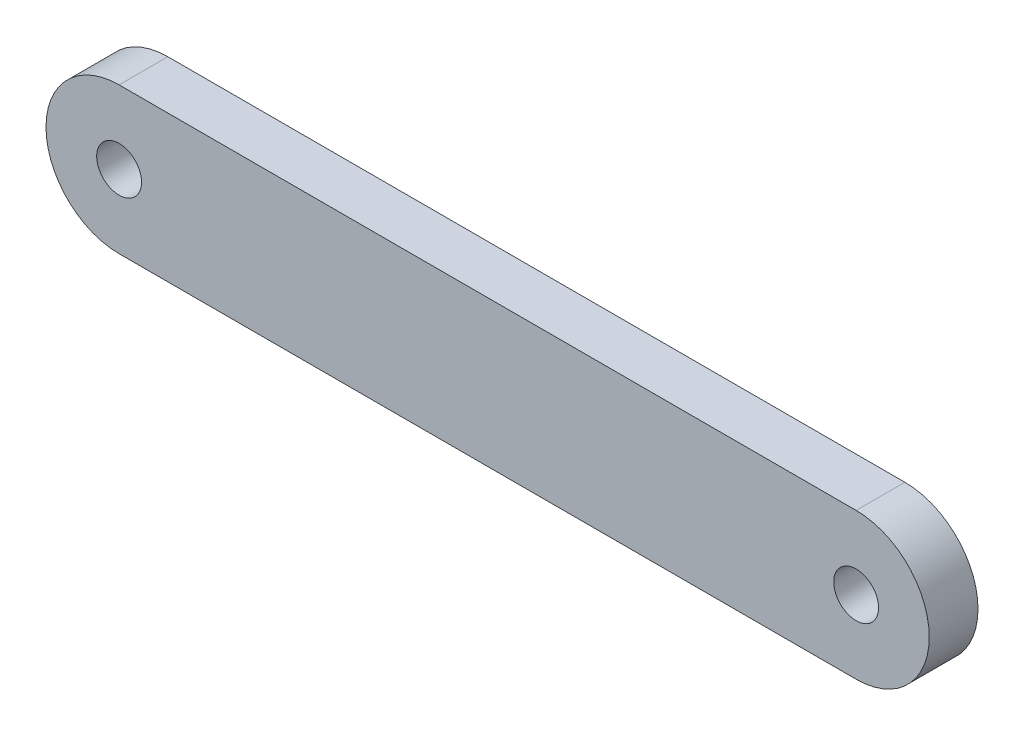
ISO-10303-21;
HEADER;
FILE_DESCRIPTION(('STEP AP214'),'2;1');
FILE_NAME('part.step','',(''),(''),'','','');
FILE_SCHEMA(('AUTOMOTIVE_DESIGN { 1 0 10303 214 1 1 1 1 }'));
ENDSEC;
DATA;
#1=APPLICATION_CONTEXT('core data for automotive mechanical design processes');
#2=APPLICATION_PROTOCOL_DEFINITION('international standard','automotive_design',2000,#1);
#3=PRODUCT_CONTEXT('',#1,'mechanical');
#4=PRODUCT('Part','Part','',(#3));
#5=PRODUCT_RELATED_PRODUCT_CATEGORY('part','',(#4));
#6=PRODUCT_DEFINITION_FORMATION('','',#4);
#7=PRODUCT_DEFINITION_CONTEXT('part definition',#1,'design');
#8=PRODUCT_DEFINITION('design','',#6,#7);
#9=PRODUCT_DEFINITION_SHAPE('','',#8);
#10=(LENGTH_UNIT() NAMED_UNIT(*) SI_UNIT(.MILLI.,.METRE.));
#11=(NAMED_UNIT(*) PLANE_ANGLE_UNIT() SI_UNIT($,.RADIAN.));
#12=(NAMED_UNIT(*) SI_UNIT($,.STERADIAN.) SOLID_ANGLE_UNIT());
#13=UNCERTAINTY_MEASURE_WITH_UNIT(LENGTH_MEASURE(1.E-05),#10,'distance_accuracy_value','');
#14=(GEOMETRIC_REPRESENTATION_CONTEXT(3) GLOBAL_UNCERTAINTY_ASSIGNED_CONTEXT((#13)) GLOBAL_UNIT_ASSIGNED_CONTEXT((#10,
#11,#12)) REPRESENTATION_CONTEXT('',''));
#15=CARTESIAN_POINT('',(0.,0.,0.));
#16=DIRECTION('',(0.,0.,1.));
#17=DIRECTION('',(1.,0.,0.));
#18=AXIS2_PLACEMENT_3D('',#15,#16,#17);
#19=CARTESIAN_POINT('',(37.8,0.,5.));
#20=DIRECTION('',(0.,0.,-1.));
#21=DIRECTION('',(-1.,0.,0.));
#22=AXIS2_PLACEMENT_3D('',#19,#20,#21);
#23=PLANE('',#22);
#24=CARTESIAN_POINT('',(37.8,0.,5.));
#25=DIRECTION('',(0.,0.,1.));
#26=DIRECTION('',(-1.,0.,0.));
#27=AXIS2_PLACEMENT_3D('',#24,#25,#26);
#28=CIRCLE('',#27,7.5);
#29=CARTESIAN_POINT('',(37.8,-7.5,5.));
#30=VERTEX_POINT('',#29);
#31=CARTESIAN_POINT('',(37.8,7.5,5.));
#32=VERTEX_POINT('',#31);
#33=EDGE_CURVE('E87',#30,#32,#28,.T.);
#34=ORIENTED_EDGE('',*,*,#33,.T.);
#35=DIRECTION('',(-1.,0.,0.));
#36=VECTOR('',#35,1.);
#37=CARTESIAN_POINT('',(-37.8,7.5,5.));
#38=LINE('',#37,#36);
#39=CARTESIAN_POINT('',(-37.8,7.5,5.));
#40=VERTEX_POINT('',#39);
#41=EDGE_CURVE('E82',#32,#40,#38,.T.);
#42=ORIENTED_EDGE('',*,*,#41,.T.);
#43=CARTESIAN_POINT('',(-37.8,0.,5.));
#44=DIRECTION('',(0.,0.,1.));
#45=DIRECTION('',(1.,0.,0.));
#46=AXIS2_PLACEMENT_3D('',#43,#44,#45);
#47=CIRCLE('',#46,7.5);
#48=CARTESIAN_POINT('',(-37.8,-7.5,5.));
#49=VERTEX_POINT('',#48);
#50=EDGE_CURVE('E85',#40,#49,#47,.T.);
#51=ORIENTED_EDGE('',*,*,#50,.T.);
#52=DIRECTION('',(1.,0.,0.));
#53=VECTOR('',#52,1.);
#54=CARTESIAN_POINT('',(-37.8,-7.5,5.));
#55=LINE('',#54,#53);
#56=EDGE_CURVE('E52',#49,#30,#55,.T.);
#57=ORIENTED_EDGE('',*,*,#56,.T.);
#58=EDGE_LOOP('',(#34,#42,#51,#57));
#59=FACE_BOUND('',#58,.T.);
#60=CARTESIAN_POINT('',(-37.8,0.,5.));
#61=DIRECTION('',(0.,0.,1.));
#62=DIRECTION('',(1.,0.,0.));
#63=AXIS2_PLACEMENT_3D('',#60,#61,#62);
#64=CIRCLE('',#63,2.3);
#65=CARTESIAN_POINT('',(-35.5,0.,5.));
#66=VERTEX_POINT('',#65);
#67=EDGE_CURVE('E102',#66,#66,#64,.T.);
#68=ORIENTED_EDGE('',*,*,#67,.F.);
#69=EDGE_LOOP('',(#68));
#70=FACE_BOUND('',#69,.T.);
#71=CARTESIAN_POINT('',(37.8,0.,5.));
#72=DIRECTION('',(0.,0.,1.));
#73=DIRECTION('',(1.,0.,0.));
#74=AXIS2_PLACEMENT_3D('',#71,#72,#73);
#75=CIRCLE('',#74,2.30000000000001);
#76=CARTESIAN_POINT('',(40.1,0.,5.));
#77=VERTEX_POINT('',#76);
#78=EDGE_CURVE('E117',#77,#77,#75,.T.);
#79=ORIENTED_EDGE('',*,*,#78,.F.);
#80=EDGE_LOOP('',(#79));
#81=FACE_BOUND('',#80,.T.);
#82=ADVANCED_FACE('F35',(#59,#70,#81),#23,.F.);
#83=CARTESIAN_POINT('',(37.8,0.,0.));
#84=DIRECTION('',(0.,0.,-1.));
#85=DIRECTION('',(-1.,0.,0.));
#86=AXIS2_PLACEMENT_3D('',#83,#84,#85);
#87=PLANE('',#86);
#88=CARTESIAN_POINT('',(-37.8,0.,0.));
#89=DIRECTION('',(0.,0.,1.));
#90=DIRECTION('',(1.,0.,0.));
#91=AXIS2_PLACEMENT_3D('',#88,#89,#90);
#92=CIRCLE('',#91,2.3);
#93=CARTESIAN_POINT('',(-35.5,0.,0.));
#94=VERTEX_POINT('',#93);
#95=EDGE_CURVE('E114',#94,#94,#92,.T.);
#96=ORIENTED_EDGE('',*,*,#95,.T.);
#97=EDGE_LOOP('',(#96));
#98=FACE_BOUND('',#97,.T.);
#99=CARTESIAN_POINT('',(37.8,0.,0.));
#100=DIRECTION('',(0.,0.,1.));
#101=DIRECTION('',(-1.,0.,0.));
#102=AXIS2_PLACEMENT_3D('',#99,#100,#101);
#103=CIRCLE('',#102,7.5);
#104=CARTESIAN_POINT('',(37.8,-7.5,0.));
#105=VERTEX_POINT('',#104);
#106=CARTESIAN_POINT('',(37.8,7.5,0.));
#107=VERTEX_POINT('',#106);
#108=EDGE_CURVE('E99',#105,#107,#103,.T.);
#109=ORIENTED_EDGE('',*,*,#108,.F.);
#110=DIRECTION('',(1.,0.,0.));
#111=VECTOR('',#110,1.);
#112=CARTESIAN_POINT('',(-37.8,-7.5,0.));
#113=LINE('',#112,#111);
#114=CARTESIAN_POINT('',(-37.8,-7.5,0.));
#115=VERTEX_POINT('',#114);
#116=EDGE_CURVE('E75',#115,#105,#113,.T.);
#117=ORIENTED_EDGE('',*,*,#116,.F.);
#118=CARTESIAN_POINT('',(-37.8,0.,0.));
#119=DIRECTION('',(0.,0.,1.));
#120=DIRECTION('',(1.,0.,0.));
#121=AXIS2_PLACEMENT_3D('',#118,#119,#120);
#122=CIRCLE('',#121,7.5);
#123=CARTESIAN_POINT('',(-37.8,7.5,0.));
#124=VERTEX_POINT('',#123);
#125=EDGE_CURVE('E69',#124,#115,#122,.T.);
#126=ORIENTED_EDGE('',*,*,#125,.F.);
#127=DIRECTION('',(-1.,0.,0.));
#128=VECTOR('',#127,1.);
#129=CARTESIAN_POINT('',(-37.8,7.5,0.));
#130=LINE('',#129,#128);
#131=EDGE_CURVE('E91',#107,#124,#130,.T.);
#132=ORIENTED_EDGE('',*,*,#131,.F.);
#133=EDGE_LOOP('',(#109,#117,#126,#132));
#134=FACE_BOUND('',#133,.T.);
#135=CARTESIAN_POINT('',(37.8,0.,0.));
#136=DIRECTION('',(0.,0.,1.));
#137=DIRECTION('',(1.,0.,0.));
#138=AXIS2_PLACEMENT_3D('',#135,#136,#137);
#139=CIRCLE('',#138,2.30000000000001);
#140=CARTESIAN_POINT('',(40.1,0.,0.));
#141=VERTEX_POINT('',#140);
#142=EDGE_CURVE('E120',#141,#141,#139,.T.);
#143=ORIENTED_EDGE('',*,*,#142,.T.);
#144=EDGE_LOOP('',(#143));
#145=FACE_BOUND('',#144,.T.);
#146=ADVANCED_FACE('F110',(#98,#134,#145),#87,.T.);
#147=CARTESIAN_POINT('',(37.8,0.,5.));
#148=DIRECTION('',(0.,0.,-1.));
#149=DIRECTION('',(-1.,0.,0.));
#150=AXIS2_PLACEMENT_3D('',#147,#148,#149);
#151=CYLINDRICAL_SURFACE('',#150,7.5);
#152=ORIENTED_EDGE('',*,*,#108,.T.);
#153=DIRECTION('',(0.,0.,-1.));
#154=VECTOR('',#153,1.);
#155=CARTESIAN_POINT('',(37.8,7.5,5.));
#156=LINE('',#155,#154);
#157=EDGE_CURVE('E11',#32,#107,#156,.T.);
#158=ORIENTED_EDGE('',*,*,#157,.F.);
#159=ORIENTED_EDGE('',*,*,#33,.F.);
#160=DIRECTION('',(0.,0.,-1.));
#161=VECTOR('',#160,1.);
#162=CARTESIAN_POINT('',(37.8,-7.5,5.));
#163=LINE('',#162,#161);
#164=EDGE_CURVE('E95',#30,#105,#163,.T.);
#165=ORIENTED_EDGE('',*,*,#164,.T.);
#166=EDGE_LOOP('',(#152,#158,#159,#165));
#167=FACE_BOUND('',#166,.T.);
#168=ADVANCED_FACE('F37',(#167),#151,.T.);
#169=CARTESIAN_POINT('',(-37.8,7.5,5.));
#170=DIRECTION('',(0.,-1.,0.));
#171=DIRECTION('',(0.,0.,-1.));
#172=AXIS2_PLACEMENT_3D('',#169,#170,#171);
#173=PLANE('',#172);
#174=ORIENTED_EDGE('',*,*,#131,.T.);
#175=DIRECTION('',(0.,0.,-1.));
#176=VECTOR('',#175,1.);
#177=CARTESIAN_POINT('',(-37.8,7.5,5.));
#178=LINE('',#177,#176);
#179=EDGE_CURVE('E44',#40,#124,#178,.T.);
#180=ORIENTED_EDGE('',*,*,#179,.F.);
#181=ORIENTED_EDGE('',*,*,#41,.F.);
#182=ORIENTED_EDGE('',*,*,#157,.T.);
#183=EDGE_LOOP('',(#174,#180,#181,#182));
#184=FACE_BOUND('',#183,.T.);
#185=ADVANCED_FACE('F90',(#184),#173,.F.);
#186=CARTESIAN_POINT('',(-37.8,0.,5.));
#187=DIRECTION('',(0.,0.,-1.));
#188=DIRECTION('',(-1.,0.,0.));
#189=AXIS2_PLACEMENT_3D('',#186,#187,#188);
#190=CYLINDRICAL_SURFACE('',#189,7.5);
#191=ORIENTED_EDGE('',*,*,#125,.T.);
#192=DIRECTION('',(0.,0.,-1.));
#193=VECTOR('',#192,1.);
#194=CARTESIAN_POINT('',(-37.8,-7.5,5.));
#195=LINE('',#194,#193);
#196=EDGE_CURVE('E92',#49,#115,#195,.T.);
#197=ORIENTED_EDGE('',*,*,#196,.F.);
#198=ORIENTED_EDGE('',*,*,#50,.F.);
#199=ORIENTED_EDGE('',*,*,#179,.T.);
#200=EDGE_LOOP('',(#191,#197,#198,#199));
#201=FACE_BOUND('',#200,.T.);
#202=ADVANCED_FACE('F93',(#201),#190,.T.);
#203=CARTESIAN_POINT('',(-37.8,-7.5,5.));
#204=DIRECTION('',(0.,1.,0.));
#205=DIRECTION('',(0.,0.,1.));
#206=AXIS2_PLACEMENT_3D('',#203,#204,#205);
#207=PLANE('',#206);
#208=ORIENTED_EDGE('',*,*,#116,.T.);
#209=ORIENTED_EDGE('',*,*,#164,.F.);
#210=ORIENTED_EDGE('',*,*,#56,.F.);
#211=ORIENTED_EDGE('',*,*,#196,.T.);
#212=EDGE_LOOP('',(#208,#209,#210,#211));
#213=FACE_BOUND('',#212,.T.);
#214=ADVANCED_FACE('F107',(#213),#207,.F.);
#215=CARTESIAN_POINT('',(-37.8,0.,5.));
#216=DIRECTION('',(0.,0.,-1.));
#217=DIRECTION('',(-1.,0.,0.));
#218=AXIS2_PLACEMENT_3D('',#215,#216,#217);
#219=CYLINDRICAL_SURFACE('',#218,2.3);
#220=ORIENTED_EDGE('',*,*,#67,.T.);
#221=EDGE_LOOP('',(#220));
#222=FACE_BOUND('',#221,.T.);
#223=ORIENTED_EDGE('',*,*,#95,.F.);
#224=EDGE_LOOP('',(#223));
#225=FACE_BOUND('',#224,.T.);
#226=ADVANCED_FACE('F137',(#222,#225),#219,.F.);
#227=CARTESIAN_POINT('',(37.8,0.,5.));
#228=DIRECTION('',(0.,0.,-1.));
#229=DIRECTION('',(-1.,0.,0.));
#230=AXIS2_PLACEMENT_3D('',#227,#228,#229);
#231=CYLINDRICAL_SURFACE('',#230,2.30000000000001);
#232=ORIENTED_EDGE('',*,*,#78,.T.);
#233=EDGE_LOOP('',(#232));
#234=FACE_BOUND('',#233,.T.);
#235=ORIENTED_EDGE('',*,*,#142,.F.);
#236=EDGE_LOOP('',(#235));
#237=FACE_BOUND('',#236,.T.);
#238=ADVANCED_FACE('F126',(#234,#237),#231,.F.);
#239=CLOSED_SHELL('',(#82,#146,#168,#185,#202,#214,#226,#238));
#240=MANIFOLD_SOLID_BREP('B2',#239);
#241=ADVANCED_BREP_SHAPE_REPRESENTATION('',(#18,#240),#14);
#242=SHAPE_DEFINITION_REPRESENTATION(#9,#241);
ENDSEC;
END-ISO-10303-21;
